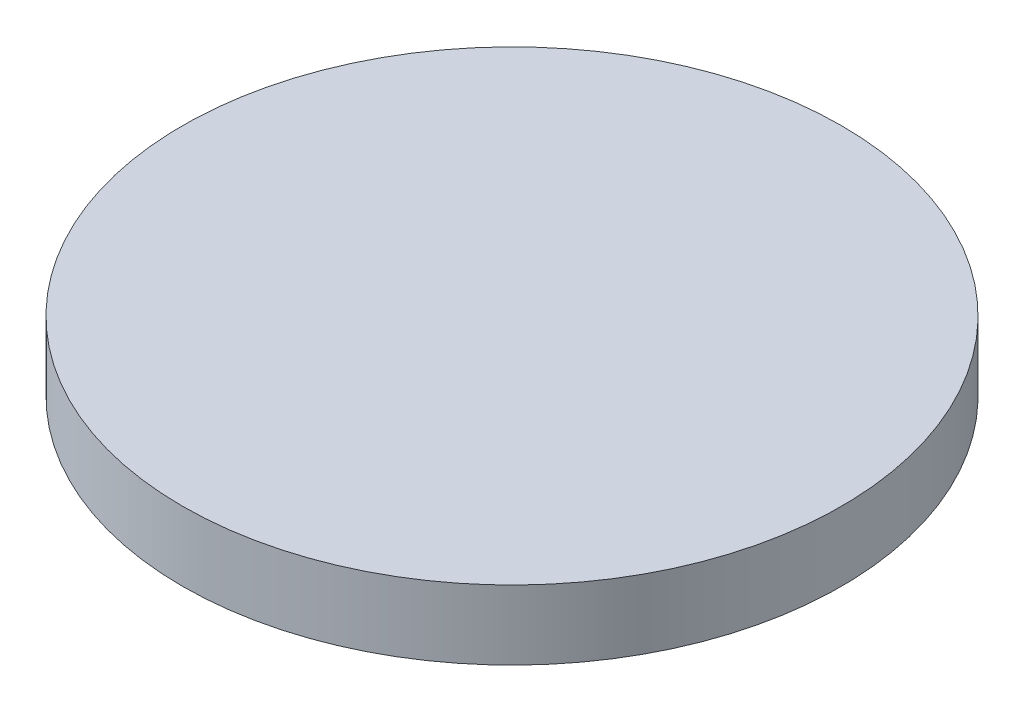
ISO-10303-21;
HEADER;
FILE_DESCRIPTION(('STEP AP214'),'2;1');
FILE_NAME('part.step','',(''),(''),'','','');
FILE_SCHEMA(('AUTOMOTIVE_DESIGN { 1 0 10303 214 1 1 1 1 }'));
ENDSEC;
DATA;
#1=APPLICATION_CONTEXT('core data for automotive mechanical design processes');
#2=APPLICATION_PROTOCOL_DEFINITION('international standard','automotive_design',2000,#1);
#3=PRODUCT_CONTEXT('',#1,'mechanical');
#4=PRODUCT('Part','Part','',(#3));
#5=PRODUCT_RELATED_PRODUCT_CATEGORY('part','',(#4));
#6=PRODUCT_DEFINITION_FORMATION('','',#4);
#7=PRODUCT_DEFINITION_CONTEXT('part definition',#1,'design');
#8=PRODUCT_DEFINITION('design','',#6,#7);
#9=PRODUCT_DEFINITION_SHAPE('','',#8);
#10=(LENGTH_UNIT() NAMED_UNIT(*) SI_UNIT(.MILLI.,.METRE.));
#11=(NAMED_UNIT(*) PLANE_ANGLE_UNIT() SI_UNIT($,.RADIAN.));
#12=(NAMED_UNIT(*) SI_UNIT($,.STERADIAN.) SOLID_ANGLE_UNIT());
#13=UNCERTAINTY_MEASURE_WITH_UNIT(LENGTH_MEASURE(1.E-05),#10,'distance_accuracy_value','');
#14=(GEOMETRIC_REPRESENTATION_CONTEXT(3) GLOBAL_UNCERTAINTY_ASSIGNED_CONTEXT((#13)) GLOBAL_UNIT_ASSIGNED_CONTEXT((#10,
#11,#12)) REPRESENTATION_CONTEXT('',''));
#15=CARTESIAN_POINT('',(0.,0.,0.));
#16=DIRECTION('',(0.,0.,1.));
#17=DIRECTION('',(1.,0.,0.));
#18=AXIS2_PLACEMENT_3D('',#15,#16,#17);
#19=CARTESIAN_POINT('',(0.,12.,0.));
#20=DIRECTION('',(0.,-1.,0.));
#21=DIRECTION('',(0.,0.,-1.));
#22=AXIS2_PLACEMENT_3D('',#19,#20,#21);
#23=CYLINDRICAL_SURFACE('',#22,57.);
#24=CARTESIAN_POINT('',(0.,12.,0.));
#25=DIRECTION('',(0.,1.,0.));
#26=DIRECTION('',(0.,0.,1.));
#27=AXIS2_PLACEMENT_3D('',#24,#25,#26);
#28=CIRCLE('',#27,57.);
#29=CARTESIAN_POINT('',(0.,12.,57.));
#30=VERTEX_POINT('',#29);
#31=EDGE_CURVE('E10',#30,#30,#28,.T.);
#32=ORIENTED_EDGE('',*,*,#31,.F.);
#33=EDGE_LOOP('',(#32));
#34=FACE_BOUND('',#33,.T.);
#35=CARTESIAN_POINT('',(0.,0.,0.));
#36=DIRECTION('',(0.,1.,0.));
#37=DIRECTION('',(0.,0.,1.));
#38=AXIS2_PLACEMENT_3D('',#35,#36,#37);
#39=CIRCLE('',#38,57.);
#40=CARTESIAN_POINT('',(0.,0.,57.));
#41=VERTEX_POINT('',#40);
#42=EDGE_CURVE('E36',#41,#41,#39,.T.);
#43=ORIENTED_EDGE('',*,*,#42,.T.);
#44=EDGE_LOOP('',(#43));
#45=FACE_BOUND('',#44,.T.);
#46=ADVANCED_FACE('F33',(#34,#45),#23,.T.);
#47=CARTESIAN_POINT('',(0.,12.,0.));
#48=DIRECTION('',(0.,1.,0.));
#49=DIRECTION('',(0.,0.,1.));
#50=AXIS2_PLACEMENT_3D('',#47,#48,#49);
#51=PLANE('',#50);
#52=ORIENTED_EDGE('',*,*,#31,.T.);
#53=EDGE_LOOP('',(#52));
#54=FACE_BOUND('',#53,.T.);
#55=ADVANCED_FACE('F48',(#54),#51,.T.);
#56=CARTESIAN_POINT('',(0.,0.,0.));
#57=DIRECTION('',(0.,1.,0.));
#58=DIRECTION('',(0.,0.,1.));
#59=AXIS2_PLACEMENT_3D('',#56,#57,#58);
#60=PLANE('',#59);
#61=ORIENTED_EDGE('',*,*,#42,.F.);
#62=EDGE_LOOP('',(#61));
#63=FACE_BOUND('',#62,.T.);
#64=ADVANCED_FACE('F46',(#63),#60,.F.);
#65=CLOSED_SHELL('',(#46,#55,#64));
#66=MANIFOLD_SOLID_BREP('B2',#65);
#67=ADVANCED_BREP_SHAPE_REPRESENTATION('',(#18,#66),#14);
#68=SHAPE_DEFINITION_REPRESENTATION(#9,#67);
ENDSEC;
END-ISO-10303-21;
